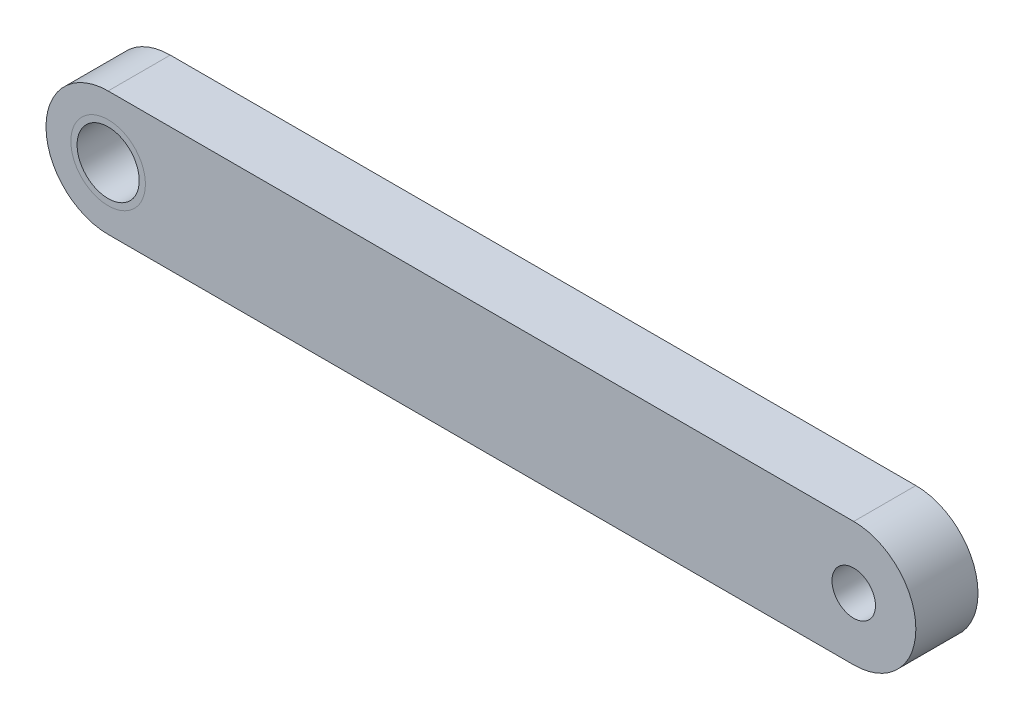
ISO-10303-21;
HEADER;
FILE_DESCRIPTION(('STEP AP214'),'2;1');
FILE_NAME('part.step','',(''),(''),'','','');
FILE_SCHEMA(('AUTOMOTIVE_DESIGN { 1 0 10303 214 1 1 1 1 }'));
ENDSEC;
DATA;
#1=APPLICATION_CONTEXT('core data for automotive mechanical design processes');
#2=APPLICATION_PROTOCOL_DEFINITION('international standard','automotive_design',2000,#1);
#3=PRODUCT_CONTEXT('',#1,'mechanical');
#4=PRODUCT('Part','Part','',(#3));
#5=PRODUCT_RELATED_PRODUCT_CATEGORY('part','',(#4));
#6=PRODUCT_DEFINITION_FORMATION('','',#4);
#7=PRODUCT_DEFINITION_CONTEXT('part definition',#1,'design');
#8=PRODUCT_DEFINITION('design','',#6,#7);
#9=PRODUCT_DEFINITION_SHAPE('','',#8);
#10=(LENGTH_UNIT() NAMED_UNIT(*) SI_UNIT(.MILLI.,.METRE.));
#11=(NAMED_UNIT(*) PLANE_ANGLE_UNIT() SI_UNIT($,.RADIAN.));
#12=(NAMED_UNIT(*) SI_UNIT($,.STERADIAN.) SOLID_ANGLE_UNIT());
#13=UNCERTAINTY_MEASURE_WITH_UNIT(LENGTH_MEASURE(1.E-05),#10,'distance_accuracy_value','');
#14=(GEOMETRIC_REPRESENTATION_CONTEXT(3) GLOBAL_UNCERTAINTY_ASSIGNED_CONTEXT((#13)) GLOBAL_UNIT_ASSIGNED_CONTEXT((#10,
#11,#12)) REPRESENTATION_CONTEXT('',''));
#15=CARTESIAN_POINT('',(0.,0.,0.));
#16=DIRECTION('',(0.,0.,1.));
#17=DIRECTION('',(1.,0.,0.));
#18=AXIS2_PLACEMENT_3D('',#15,#16,#17);
#19=CARTESIAN_POINT('',(-69.9376957920821,21.0386174846107,-2.5));
#20=DIRECTION('',(0.,0.,1.));
#21=DIRECTION('',(1.,0.,0.));
#22=AXIS2_PLACEMENT_3D('',#19,#20,#21);
#23=CYLINDRICAL_SURFACE('',#22,2.99999999999999);
#24=CARTESIAN_POINT('',(-69.9376957920821,21.0386174846107,-2.5));
#25=DIRECTION('',(0.,0.,1.));
#26=DIRECTION('',(1.,0.,0.));
#27=AXIS2_PLACEMENT_3D('',#24,#25,#26);
#28=CIRCLE('',#27,2.99999999999999);
#29=CARTESIAN_POINT('',(-66.9376957920821,21.0386174846107,-2.5));
#30=VERTEX_POINT('',#29);
#31=EDGE_CURVE('E11',#30,#30,#28,.T.);
#32=ORIENTED_EDGE('',*,*,#31,.T.);
#33=EDGE_LOOP('',(#32));
#34=FACE_BOUND('',#33,.T.);
#35=CARTESIAN_POINT('',(-69.9376957920821,21.0386174846107,2.5));
#36=DIRECTION('',(0.,0.,1.));
#37=DIRECTION('',(1.,0.,0.));
#38=AXIS2_PLACEMENT_3D('',#35,#36,#37);
#39=CIRCLE('',#38,2.99999999999999);
#40=CARTESIAN_POINT('',(-66.9376957920821,21.0386174846107,2.5));
#41=VERTEX_POINT('',#40);
#42=EDGE_CURVE('E50',#41,#41,#39,.T.);
#43=ORIENTED_EDGE('',*,*,#42,.F.);
#44=EDGE_LOOP('',(#43));
#45=FACE_BOUND('',#44,.T.);
#46=ADVANCED_FACE('F47',(#34,#45),#23,.T.);
#47=CARTESIAN_POINT('',(-69.9376957920821,21.0386174846107,-2.5));
#48=DIRECTION('',(0.,0.,1.));
#49=DIRECTION('',(1.,0.,0.));
#50=AXIS2_PLACEMENT_3D('',#47,#48,#49);
#51=PLANE('',#50);
#52=CARTESIAN_POINT('',(-69.9376957920821,21.0386174846107,-2.5));
#53=DIRECTION('',(0.,0.,1.));
#54=DIRECTION('',(1.,0.,0.));
#55=AXIS2_PLACEMENT_3D('',#52,#53,#54);
#56=CIRCLE('',#55,2.50000000000001);
#57=CARTESIAN_POINT('',(-67.4376957920821,21.0386174846107,-2.5));
#58=VERTEX_POINT('',#57);
#59=EDGE_CURVE('E57',#58,#58,#56,.T.);
#60=ORIENTED_EDGE('',*,*,#59,.T.);
#61=EDGE_LOOP('',(#60));
#62=FACE_BOUND('',#61,.T.);
#63=ORIENTED_EDGE('',*,*,#31,.F.);
#64=EDGE_LOOP('',(#63));
#65=FACE_BOUND('',#64,.T.);
#66=ADVANCED_FACE('F65',(#62,#65),#51,.F.);
#67=CARTESIAN_POINT('',(-69.9376957920821,21.0386174846107,2.5));
#68=DIRECTION('',(0.,0.,1.));
#69=DIRECTION('',(1.,0.,0.));
#70=AXIS2_PLACEMENT_3D('',#67,#68,#69);
#71=PLANE('',#70);
#72=CARTESIAN_POINT('',(-69.9376957920821,21.0386174846107,2.5));
#73=DIRECTION('',(0.,0.,1.));
#74=DIRECTION('',(1.,0.,0.));
#75=AXIS2_PLACEMENT_3D('',#72,#73,#74);
#76=CIRCLE('',#75,2.50000000000001);
#77=CARTESIAN_POINT('',(-67.4376957920821,21.0386174846107,2.5));
#78=VERTEX_POINT('',#77);
#79=EDGE_CURVE('E59',#78,#78,#76,.T.);
#80=ORIENTED_EDGE('',*,*,#79,.F.);
#81=EDGE_LOOP('',(#80));
#82=FACE_BOUND('',#81,.T.);
#83=ORIENTED_EDGE('',*,*,#42,.T.);
#84=EDGE_LOOP('',(#83));
#85=FACE_BOUND('',#84,.T.);
#86=ADVANCED_FACE('F71',(#82,#85),#71,.T.);
#87=CARTESIAN_POINT('',(-69.9376957920821,21.0386174846107,-2.5));
#88=DIRECTION('',(0.,0.,1.));
#89=DIRECTION('',(1.,0.,0.));
#90=AXIS2_PLACEMENT_3D('',#87,#88,#89);
#91=CYLINDRICAL_SURFACE('',#90,2.50000000000001);
#92=ORIENTED_EDGE('',*,*,#59,.F.);
#93=EDGE_LOOP('',(#92));
#94=FACE_BOUND('',#93,.T.);
#95=ORIENTED_EDGE('',*,*,#79,.T.);
#96=EDGE_LOOP('',(#95));
#97=FACE_BOUND('',#96,.T.);
#98=ADVANCED_FACE('F68',(#94,#97),#91,.F.);
#99=CLOSED_SHELL('',(#46,#66,#86,#98));
#100=MANIFOLD_SOLID_BREP('B2',#99);
#101=CARTESIAN_POINT('',(-69.9376957920821,21.0386174846107,2.5));
#102=DIRECTION('',(0.,0.,1.));
#103=DIRECTION('',(1.,0.,0.));
#104=AXIS2_PLACEMENT_3D('',#101,#102,#103);
#105=PLANE('',#104);
#106=CARTESIAN_POINT('',(-9.93769579208213,21.0386174846107,2.5));
#107=DIRECTION('',(0.,0.,1.));
#108=DIRECTION('',(1.,0.,0.));
#109=AXIS2_PLACEMENT_3D('',#106,#107,#108);
#110=CIRCLE('',#109,1.75);
#111=CARTESIAN_POINT('',(-8.18769579208213,21.0386174846107,2.5));
#112=VERTEX_POINT('',#111);
#113=EDGE_CURVE('E191',#112,#112,#110,.T.);
#114=ORIENTED_EDGE('',*,*,#113,.F.);
#115=EDGE_LOOP('',(#114));
#116=FACE_BOUND('',#115,.T.);
#117=CARTESIAN_POINT('',(-69.9376957920821,21.0386174846107,2.5));
#118=DIRECTION('',(0.,0.,1.));
#119=DIRECTION('',(1.,0.,0.));
#120=AXIS2_PLACEMENT_3D('',#117,#118,#119);
#121=CIRCLE('',#120,3.00000000000001);
#122=CARTESIAN_POINT('',(-66.9376957920821,21.0386174846107,2.5));
#123=VERTEX_POINT('',#122);
#124=EDGE_CURVE('E187',#123,#123,#121,.T.);
#125=ORIENTED_EDGE('',*,*,#124,.F.);
#126=EDGE_LOOP('',(#125));
#127=FACE_BOUND('',#126,.T.);
#128=CARTESIAN_POINT('',(-69.9376957920821,21.0386174846107,2.5));
#129=DIRECTION('',(0.,0.,1.));
#130=DIRECTION('',(1.,0.,0.));
#131=AXIS2_PLACEMENT_3D('',#128,#129,#130);
#132=CIRCLE('',#131,5.);
#133=CARTESIAN_POINT('',(-69.9376957920821,26.0386174846107,2.5));
#134=VERTEX_POINT('',#133);
#135=CARTESIAN_POINT('',(-69.9376957920821,16.0386174846107,2.5));
#136=VERTEX_POINT('',#135);
#137=EDGE_CURVE('E161',#134,#136,#132,.T.);
#138=ORIENTED_EDGE('',*,*,#137,.T.);
#139=DIRECTION('',(1.,0.,0.));
#140=VECTOR('',#139,1.);
#141=CARTESIAN_POINT('',(-69.9376957920821,16.0386174846107,2.5));
#142=LINE('',#141,#140);
#143=CARTESIAN_POINT('',(-9.93769579208213,16.0386174846107,2.5));
#144=VERTEX_POINT('',#143);
#145=EDGE_CURVE('E157',#136,#144,#142,.T.);
#146=ORIENTED_EDGE('',*,*,#145,.T.);
#147=CARTESIAN_POINT('',(-9.93769579208213,21.0386174846107,2.5));
#148=DIRECTION('',(0.,0.,1.));
#149=DIRECTION('',(-1.,0.,0.));
#150=AXIS2_PLACEMENT_3D('',#147,#148,#149);
#151=CIRCLE('',#150,5.);
#152=CARTESIAN_POINT('',(-9.93769579208213,26.0386174846107,2.5));
#153=VERTEX_POINT('',#152);
#154=EDGE_CURVE('E159',#144,#153,#151,.T.);
#155=ORIENTED_EDGE('',*,*,#154,.T.);
#156=DIRECTION('',(-1.,0.,0.));
#157=VECTOR('',#156,1.);
#158=CARTESIAN_POINT('',(-69.9376957920821,26.0386174846107,2.5));
#159=LINE('',#158,#157);
#160=EDGE_CURVE('E127',#153,#134,#159,.T.);
#161=ORIENTED_EDGE('',*,*,#160,.T.);
#162=EDGE_LOOP('',(#138,#146,#155,#161));
#163=FACE_BOUND('',#162,.T.);
#164=ADVANCED_FACE('F109',(#116,#127,#163),#105,.T.);
#165=CARTESIAN_POINT('',(-69.9376957920821,21.0386174846107,-2.5));
#166=DIRECTION('',(0.,0.,1.));
#167=DIRECTION('',(1.,0.,0.));
#168=AXIS2_PLACEMENT_3D('',#165,#166,#167);
#169=PLANE('',#168);
#170=CARTESIAN_POINT('',(-9.93769579208213,21.0386174846107,-2.5));
#171=DIRECTION('',(0.,0.,1.));
#172=DIRECTION('',(1.,0.,0.));
#173=AXIS2_PLACEMENT_3D('',#170,#171,#172);
#174=CIRCLE('',#173,1.75);
#175=CARTESIAN_POINT('',(-8.18769579208213,21.0386174846107,-2.5));
#176=VERTEX_POINT('',#175);
#177=EDGE_CURVE('E190',#176,#176,#174,.T.);
#178=ORIENTED_EDGE('',*,*,#177,.T.);
#179=EDGE_LOOP('',(#178));
#180=FACE_BOUND('',#179,.T.);
#181=CARTESIAN_POINT('',(-69.9376957920821,21.0386174846107,-2.5));
#182=DIRECTION('',(0.,0.,1.));
#183=DIRECTION('',(1.,0.,0.));
#184=AXIS2_PLACEMENT_3D('',#181,#182,#183);
#185=CIRCLE('',#184,3.00000000000001);
#186=CARTESIAN_POINT('',(-66.9376957920821,21.0386174846107,-2.5));
#187=VERTEX_POINT('',#186);
#188=EDGE_CURVE('E113',#187,#187,#185,.T.);
#189=ORIENTED_EDGE('',*,*,#188,.T.);
#190=EDGE_LOOP('',(#189));
#191=FACE_BOUND('',#190,.T.);
#192=CARTESIAN_POINT('',(-69.9376957920821,21.0386174846107,-2.5));
#193=DIRECTION('',(0.,0.,1.));
#194=DIRECTION('',(1.,0.,0.));
#195=AXIS2_PLACEMENT_3D('',#192,#193,#194);
#196=CIRCLE('',#195,5.);
#197=CARTESIAN_POINT('',(-69.9376957920821,26.0386174846107,-2.5));
#198=VERTEX_POINT('',#197);
#199=CARTESIAN_POINT('',(-69.9376957920821,16.0386174846107,-2.5));
#200=VERTEX_POINT('',#199);
#201=EDGE_CURVE('E174',#198,#200,#196,.T.);
#202=ORIENTED_EDGE('',*,*,#201,.F.);
#203=DIRECTION('',(-1.,0.,0.));
#204=VECTOR('',#203,1.);
#205=CARTESIAN_POINT('',(-69.9376957920821,26.0386174846107,-2.5));
#206=LINE('',#205,#204);
#207=CARTESIAN_POINT('',(-9.93769579208213,26.0386174846107,-2.5));
#208=VERTEX_POINT('',#207);
#209=EDGE_CURVE('E150',#208,#198,#206,.T.);
#210=ORIENTED_EDGE('',*,*,#209,.F.);
#211=CARTESIAN_POINT('',(-9.93769579208213,21.0386174846107,-2.5));
#212=DIRECTION('',(0.,0.,1.));
#213=DIRECTION('',(-1.,0.,0.));
#214=AXIS2_PLACEMENT_3D('',#211,#212,#213);
#215=CIRCLE('',#214,5.);
#216=CARTESIAN_POINT('',(-9.93769579208213,16.0386174846107,-2.5));
#217=VERTEX_POINT('',#216);
#218=EDGE_CURVE('E144',#217,#208,#215,.T.);
#219=ORIENTED_EDGE('',*,*,#218,.F.);
#220=DIRECTION('',(1.,0.,0.));
#221=VECTOR('',#220,1.);
#222=CARTESIAN_POINT('',(-69.9376957920821,16.0386174846107,-2.5));
#223=LINE('',#222,#221);
#224=EDGE_CURVE('E165',#200,#217,#223,.T.);
#225=ORIENTED_EDGE('',*,*,#224,.F.);
#226=EDGE_LOOP('',(#202,#210,#219,#225));
#227=FACE_BOUND('',#226,.T.);
#228=ADVANCED_FACE('F184',(#180,#191,#227),#169,.F.);
#229=CARTESIAN_POINT('',(-69.9376957920821,21.0386174846107,2.5));
#230=DIRECTION('',(0.,0.,-1.));
#231=DIRECTION('',(-1.,0.,0.));
#232=AXIS2_PLACEMENT_3D('',#229,#230,#231);
#233=CYLINDRICAL_SURFACE('',#232,5.);
#234=ORIENTED_EDGE('',*,*,#201,.T.);
#235=DIRECTION('',(0.,0.,-1.));
#236=VECTOR('',#235,1.);
#237=CARTESIAN_POINT('',(-69.9376957920821,16.0386174846107,2.5));
#238=LINE('',#237,#236);
#239=EDGE_CURVE('E45',#136,#200,#238,.T.);
#240=ORIENTED_EDGE('',*,*,#239,.F.);
#241=ORIENTED_EDGE('',*,*,#137,.F.);
#242=DIRECTION('',(0.,0.,-1.));
#243=VECTOR('',#242,1.);
#244=CARTESIAN_POINT('',(-69.9376957920821,26.0386174846107,2.5));
#245=LINE('',#244,#243);
#246=EDGE_CURVE('E170',#134,#198,#245,.T.);
#247=ORIENTED_EDGE('',*,*,#246,.T.);
#248=EDGE_LOOP('',(#234,#240,#241,#247));
#249=FACE_BOUND('',#248,.T.);
#250=ADVANCED_FACE('F111',(#249),#233,.T.);
#251=CARTESIAN_POINT('',(-69.9376957920821,16.0386174846107,2.5));
#252=DIRECTION('',(0.,1.,0.));
#253=DIRECTION('',(0.,0.,1.));
#254=AXIS2_PLACEMENT_3D('',#251,#252,#253);
#255=PLANE('',#254);
#256=ORIENTED_EDGE('',*,*,#224,.T.);
#257=DIRECTION('',(0.,0.,-1.));
#258=VECTOR('',#257,1.);
#259=CARTESIAN_POINT('',(-9.93769579208213,16.0386174846107,2.5));
#260=LINE('',#259,#258);
#261=EDGE_CURVE('E119',#144,#217,#260,.T.);
#262=ORIENTED_EDGE('',*,*,#261,.F.);
#263=ORIENTED_EDGE('',*,*,#145,.F.);
#264=ORIENTED_EDGE('',*,*,#239,.T.);
#265=EDGE_LOOP('',(#256,#262,#263,#264));
#266=FACE_BOUND('',#265,.T.);
#267=ADVANCED_FACE('F164',(#266),#255,.F.);
#268=CARTESIAN_POINT('',(-9.93769579208213,21.0386174846107,2.5));
#269=DIRECTION('',(0.,0.,-1.));
#270=DIRECTION('',(-1.,0.,0.));
#271=AXIS2_PLACEMENT_3D('',#268,#269,#270);
#272=CYLINDRICAL_SURFACE('',#271,5.);
#273=ORIENTED_EDGE('',*,*,#218,.T.);
#274=DIRECTION('',(0.,0.,-1.));
#275=VECTOR('',#274,1.);
#276=CARTESIAN_POINT('',(-9.93769579208213,26.0386174846107,2.5));
#277=LINE('',#276,#275);
#278=EDGE_CURVE('E166',#153,#208,#277,.T.);
#279=ORIENTED_EDGE('',*,*,#278,.F.);
#280=ORIENTED_EDGE('',*,*,#154,.F.);
#281=ORIENTED_EDGE('',*,*,#261,.T.);
#282=EDGE_LOOP('',(#273,#279,#280,#281));
#283=FACE_BOUND('',#282,.T.);
#284=ADVANCED_FACE('F168',(#283),#272,.T.);
#285=CARTESIAN_POINT('',(-69.9376957920821,26.0386174846107,2.5));
#286=DIRECTION('',(0.,-1.,0.));
#287=DIRECTION('',(1.,0.,0.));
#288=AXIS2_PLACEMENT_3D('',#285,#286,#287);
#289=PLANE('',#288);
#290=ORIENTED_EDGE('',*,*,#209,.T.);
#291=ORIENTED_EDGE('',*,*,#246,.F.);
#292=ORIENTED_EDGE('',*,*,#160,.F.);
#293=ORIENTED_EDGE('',*,*,#278,.T.);
#294=EDGE_LOOP('',(#290,#291,#292,#293));
#295=FACE_BOUND('',#294,.T.);
#296=ADVANCED_FACE('F181',(#295),#289,.F.);
#297=CARTESIAN_POINT('',(-69.9376957920821,21.0386174846107,-7.5));
#298=DIRECTION('',(0.,0.,1.));
#299=DIRECTION('',(1.,0.,0.));
#300=AXIS2_PLACEMENT_3D('',#297,#298,#299);
#301=CYLINDRICAL_SURFACE('',#300,3.00000000000001);
#302=ORIENTED_EDGE('',*,*,#124,.T.);
#303=EDGE_LOOP('',(#302));
#304=FACE_BOUND('',#303,.T.);
#305=ORIENTED_EDGE('',*,*,#188,.F.);
#306=EDGE_LOOP('',(#305));
#307=FACE_BOUND('',#306,.T.);
#308=ADVANCED_FACE('F202',(#304,#307),#301,.F.);
#309=CARTESIAN_POINT('',(-9.93769579208213,21.0386174846107,-2.5));
#310=DIRECTION('',(0.,0.,1.));
#311=DIRECTION('',(1.,0.,0.));
#312=AXIS2_PLACEMENT_3D('',#309,#310,#311);
#313=CYLINDRICAL_SURFACE('',#312,1.75);
#314=ORIENTED_EDGE('',*,*,#177,.F.);
#315=EDGE_LOOP('',(#314));
#316=FACE_BOUND('',#315,.T.);
#317=ORIENTED_EDGE('',*,*,#113,.T.);
#318=EDGE_LOOP('',(#317));
#319=FACE_BOUND('',#318,.T.);
#320=ADVANCED_FACE('F199',(#316,#319),#313,.F.);
#321=CLOSED_SHELL('',(#164,#228,#250,#267,#284,#296,#308,#320));
#322=MANIFOLD_SOLID_BREP('B6',#321);
#323=ADVANCED_BREP_SHAPE_REPRESENTATION('',(#18,#100,#322),#14);
#324=SHAPE_DEFINITION_REPRESENTATION(#9,#323);
ENDSEC;
END-ISO-10303-21;
